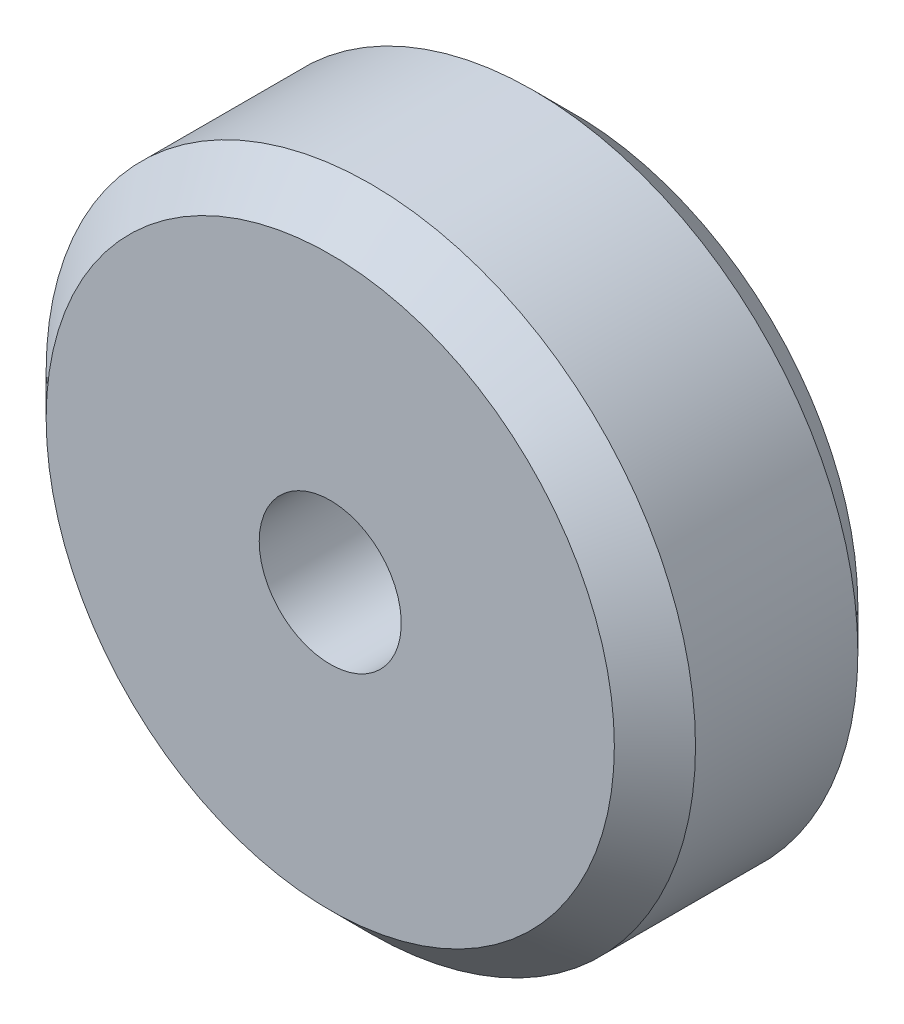
ISO-10303-21;
HEADER;
FILE_DESCRIPTION(('STEP AP214'),'2;1');
FILE_NAME('part.step','',(''),(''),'','','');
FILE_SCHEMA(('AUTOMOTIVE_DESIGN { 1 0 10303 214 1 1 1 1 }'));
ENDSEC;
DATA;
#1=APPLICATION_CONTEXT('core data for automotive mechanical design processes');
#2=APPLICATION_PROTOCOL_DEFINITION('international standard','automotive_design',2000,#1);
#3=PRODUCT_CONTEXT('',#1,'mechanical');
#4=PRODUCT('Part','Part','',(#3));
#5=PRODUCT_RELATED_PRODUCT_CATEGORY('part','',(#4));
#6=PRODUCT_DEFINITION_FORMATION('','',#4);
#7=PRODUCT_DEFINITION_CONTEXT('part definition',#1,'design');
#8=PRODUCT_DEFINITION('design','',#6,#7);
#9=PRODUCT_DEFINITION_SHAPE('','',#8);
#10=(LENGTH_UNIT() NAMED_UNIT(*) SI_UNIT(.MILLI.,.METRE.));
#11=(NAMED_UNIT(*) PLANE_ANGLE_UNIT() SI_UNIT($,.RADIAN.));
#12=(NAMED_UNIT(*) SI_UNIT($,.STERADIAN.) SOLID_ANGLE_UNIT());
#13=UNCERTAINTY_MEASURE_WITH_UNIT(LENGTH_MEASURE(1.E-05),#10,'distance_accuracy_value','');
#14=(GEOMETRIC_REPRESENTATION_CONTEXT(3) GLOBAL_UNCERTAINTY_ASSIGNED_CONTEXT((#13)) GLOBAL_UNIT_ASSIGNED_CONTEXT((#10,
#11,#12)) REPRESENTATION_CONTEXT('',''));
#15=CARTESIAN_POINT('',(0.,0.,0.));
#16=DIRECTION('',(0.,0.,1.));
#17=DIRECTION('',(1.,0.,0.));
#18=AXIS2_PLACEMENT_3D('',#15,#16,#17);
#19=CARTESIAN_POINT('',(0.,0.,0.));
#20=DIRECTION('',(0.,0.,1.));
#21=DIRECTION('',(1.,0.,0.));
#22=AXIS2_PLACEMENT_3D('',#19,#20,#21);
#23=PLANE('',#22);
#24=CARTESIAN_POINT('',(0.,0.,0.));
#25=DIRECTION('',(0.,0.,1.));
#26=DIRECTION('',(1.,0.,0.));
#27=AXIS2_PLACEMENT_3D('',#24,#25,#26);
#28=CIRCLE('',#27,14.);
#29=CARTESIAN_POINT('',(14.,0.,0.));
#30=VERTEX_POINT('',#29);
#31=EDGE_CURVE('E10',#30,#30,#28,.F.);
#32=ORIENTED_EDGE('',*,*,#31,.T.);
#33=EDGE_LOOP('',(#32));
#34=FACE_BOUND('',#33,.T.);
#35=CARTESIAN_POINT('',(0.,0.,0.));
#36=DIRECTION('',(0.,0.,1.));
#37=DIRECTION('',(1.,0.,0.));
#38=AXIS2_PLACEMENT_3D('',#35,#36,#37);
#39=CIRCLE('',#38,3.5);
#40=CARTESIAN_POINT('',(3.5,0.,0.));
#41=VERTEX_POINT('',#40);
#42=EDGE_CURVE('E51',#41,#41,#39,.T.);
#43=ORIENTED_EDGE('',*,*,#42,.T.);
#44=EDGE_LOOP('',(#43));
#45=FACE_BOUND('',#44,.T.);
#46=ADVANCED_FACE('F28',(#34,#45),#23,.F.);
#47=CARTESIAN_POINT('',(0.,0.,57.254833995939));
#48=DIRECTION('',(0.,0.,-1.));
#49=DIRECTION('',(-1.,0.,0.));
#50=AXIS2_PLACEMENT_3D('',#47,#48,#49);
#51=CYLINDRICAL_SURFACE('',#50,16.);
#52=CARTESIAN_POINT('',(0.,0.,10.));
#53=DIRECTION('',(0.,0.,-1.));
#54=DIRECTION('',(-1.,0.,0.));
#55=AXIS2_PLACEMENT_3D('',#52,#53,#54);
#56=CIRCLE('',#55,16.);
#57=CARTESIAN_POINT('',(-16.,0.,10.));
#58=VERTEX_POINT('',#57);
#59=EDGE_CURVE('E39',#58,#58,#56,.T.);
#60=ORIENTED_EDGE('',*,*,#59,.T.);
#61=EDGE_LOOP('',(#60));
#62=FACE_BOUND('',#61,.T.);
#63=CARTESIAN_POINT('',(0.,0.,1.99999999999999));
#64=DIRECTION('',(0.,0.,1.));
#65=DIRECTION('',(1.,0.,0.));
#66=AXIS2_PLACEMENT_3D('',#63,#64,#65);
#67=CIRCLE('',#66,16.);
#68=CARTESIAN_POINT('',(16.,0.,1.99999999999999));
#69=VERTEX_POINT('',#68);
#70=EDGE_CURVE('E43',#69,#69,#67,.T.);
#71=ORIENTED_EDGE('',*,*,#70,.T.);
#72=EDGE_LOOP('',(#71));
#73=FACE_BOUND('',#72,.T.);
#74=ADVANCED_FACE('F59',(#62,#73),#51,.T.);
#75=CARTESIAN_POINT('',(0.,0.,57.254833995939));
#76=DIRECTION('',(0.,0.,-1.));
#77=DIRECTION('',(-1.,0.,0.));
#78=AXIS2_PLACEMENT_3D('',#75,#76,#77);
#79=CYLINDRICAL_SURFACE('',#78,3.5);
#80=CARTESIAN_POINT('',(0.,0.,12.));
#81=DIRECTION('',(0.,0.,-1.));
#82=DIRECTION('',(-1.,0.,0.));
#83=AXIS2_PLACEMENT_3D('',#80,#81,#82);
#84=CIRCLE('',#83,3.5);
#85=CARTESIAN_POINT('',(-3.5,0.,12.));
#86=VERTEX_POINT('',#85);
#87=EDGE_CURVE('E48',#86,#86,#84,.T.);
#88=ORIENTED_EDGE('',*,*,#87,.F.);
#89=EDGE_LOOP('',(#88));
#90=FACE_BOUND('',#89,.T.);
#91=ORIENTED_EDGE('',*,*,#42,.F.);
#92=EDGE_LOOP('',(#91));
#93=FACE_BOUND('',#92,.T.);
#94=ADVANCED_FACE('F56',(#90,#93),#79,.F.);
#95=CARTESIAN_POINT('',(-25.627302965654,-5.54226514706764,12.));
#96=DIRECTION('',(0.,0.,-1.));
#97=DIRECTION('',(-0.648659956779408,-0.761078353700154,0.));
#98=AXIS2_PLACEMENT_3D('',#95,#96,#97);
#99=PLANE('',#98);
#100=CARTESIAN_POINT('',(0.,0.,12.));
#101=DIRECTION('',(0.,0.,-1.));
#102=DIRECTION('',(-1.,0.,0.));
#103=AXIS2_PLACEMENT_3D('',#100,#101,#102);
#104=CIRCLE('',#103,14.);
#105=CARTESIAN_POINT('',(-14.,0.,12.));
#106=VERTEX_POINT('',#105);
#107=EDGE_CURVE('E35',#106,#106,#104,.F.);
#108=ORIENTED_EDGE('',*,*,#107,.T.);
#109=EDGE_LOOP('',(#108));
#110=FACE_BOUND('',#109,.T.);
#111=ORIENTED_EDGE('',*,*,#87,.T.);
#112=EDGE_LOOP('',(#111));
#113=FACE_BOUND('',#112,.T.);
#114=ADVANCED_FACE('F58',(#110,#113),#99,.F.);
#115=CARTESIAN_POINT('',(0.,0.,10.));
#116=DIRECTION('',(0.,0.,-1.));
#117=DIRECTION('',(-1.,0.,0.));
#118=AXIS2_PLACEMENT_3D('',#115,#116,#117);
#119=CONICAL_SURFACE('',#118,16.,0.785398163397449);
#120=ORIENTED_EDGE('',*,*,#107,.F.);
#121=EDGE_LOOP('',(#120));
#122=FACE_BOUND('',#121,.T.);
#123=ORIENTED_EDGE('',*,*,#59,.F.);
#124=EDGE_LOOP('',(#123));
#125=FACE_BOUND('',#124,.T.);
#126=ADVANCED_FACE('F66',(#122,#125),#119,.T.);
#127=CARTESIAN_POINT('',(0.,0.,1.99999999999999));
#128=DIRECTION('',(0.,0.,1.));
#129=DIRECTION('',(1.,0.,0.));
#130=AXIS2_PLACEMENT_3D('',#127,#128,#129);
#131=CONICAL_SURFACE('',#130,16.,0.78539816339745);
#132=ORIENTED_EDGE('',*,*,#31,.F.);
#133=EDGE_LOOP('',(#132));
#134=FACE_BOUND('',#133,.T.);
#135=ORIENTED_EDGE('',*,*,#70,.F.);
#136=EDGE_LOOP('',(#135));
#137=FACE_BOUND('',#136,.T.);
#138=ADVANCED_FACE('F30',(#134,#137),#131,.T.);
#139=CLOSED_SHELL('',(#46,#74,#94,#114,#126,#138));
#140=MANIFOLD_SOLID_BREP('B2',#139);
#141=ADVANCED_BREP_SHAPE_REPRESENTATION('',(#18,#140),#14);
#142=SHAPE_DEFINITION_REPRESENTATION(#9,#141);
ENDSEC;
END-ISO-10303-21;
